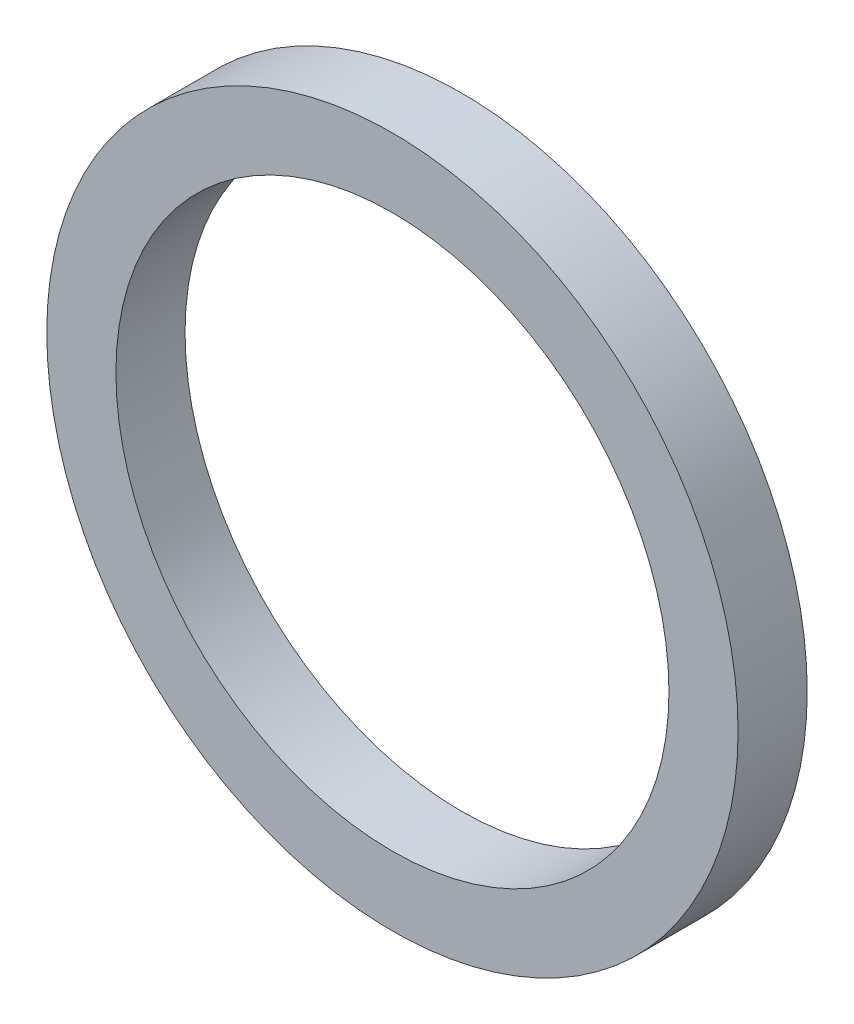
ISO-10303-21;
HEADER;
FILE_DESCRIPTION(('STEP AP214'),'2;1');
FILE_NAME('part.step','',(''),(''),'','','');
FILE_SCHEMA(('AUTOMOTIVE_DESIGN { 1 0 10303 214 1 1 1 1 }'));
ENDSEC;
DATA;
#1=APPLICATION_CONTEXT('core data for automotive mechanical design processes');
#2=APPLICATION_PROTOCOL_DEFINITION('international standard','automotive_design',2000,#1);
#3=PRODUCT_CONTEXT('',#1,'mechanical');
#4=PRODUCT('Part','Part','',(#3));
#5=PRODUCT_RELATED_PRODUCT_CATEGORY('part','',(#4));
#6=PRODUCT_DEFINITION_FORMATION('','',#4);
#7=PRODUCT_DEFINITION_CONTEXT('part definition',#1,'design');
#8=PRODUCT_DEFINITION('design','',#6,#7);
#9=PRODUCT_DEFINITION_SHAPE('','',#8);
#10=(LENGTH_UNIT() NAMED_UNIT(*) SI_UNIT(.MILLI.,.METRE.));
#11=(NAMED_UNIT(*) PLANE_ANGLE_UNIT() SI_UNIT($,.RADIAN.));
#12=(NAMED_UNIT(*) SI_UNIT($,.STERADIAN.) SOLID_ANGLE_UNIT());
#13=UNCERTAINTY_MEASURE_WITH_UNIT(LENGTH_MEASURE(1.E-05),#10,'distance_accuracy_value','');
#14=(GEOMETRIC_REPRESENTATION_CONTEXT(3) GLOBAL_UNCERTAINTY_ASSIGNED_CONTEXT((#13)) GLOBAL_UNIT_ASSIGNED_CONTEXT((#10,
#11,#12)) REPRESENTATION_CONTEXT('',''));
#15=CARTESIAN_POINT('',(0.,0.,0.));
#16=DIRECTION('',(0.,0.,1.));
#17=DIRECTION('',(1.,0.,0.));
#18=AXIS2_PLACEMENT_3D('',#15,#16,#17);
#19=CARTESIAN_POINT('',(0.,0.,1.));
#20=DIRECTION('',(0.,0.,1.));
#21=DIRECTION('',(1.,0.,0.));
#22=AXIS2_PLACEMENT_3D('',#19,#20,#21);
#23=PLANE('',#22);
#24=CARTESIAN_POINT('',(0.,0.,1.));
#25=DIRECTION('',(0.,0.,1.));
#26=DIRECTION('',(1.,0.,0.));
#27=AXIS2_PLACEMENT_3D('',#24,#25,#26);
#28=CIRCLE('',#27,5.);
#29=CARTESIAN_POINT('',(5.,0.,1.));
#30=VERTEX_POINT('',#29);
#31=EDGE_CURVE('E10',#30,#30,#28,.T.);
#32=ORIENTED_EDGE('',*,*,#31,.T.);
#33=EDGE_LOOP('',(#32));
#34=FACE_BOUND('',#33,.T.);
#35=CARTESIAN_POINT('',(0.,0.,1.));
#36=DIRECTION('',(0.,0.,1.));
#37=DIRECTION('',(1.,0.,0.));
#38=AXIS2_PLACEMENT_3D('',#35,#36,#37);
#39=CIRCLE('',#38,4.);
#40=CARTESIAN_POINT('',(4.,0.,1.));
#41=VERTEX_POINT('',#40);
#42=EDGE_CURVE('E43',#41,#41,#39,.T.);
#43=ORIENTED_EDGE('',*,*,#42,.F.);
#44=EDGE_LOOP('',(#43));
#45=FACE_BOUND('',#44,.T.);
#46=ADVANCED_FACE('F32',(#34,#45),#23,.T.);
#47=CARTESIAN_POINT('',(0.,0.,0.));
#48=DIRECTION('',(0.,0.,1.));
#49=DIRECTION('',(1.,0.,0.));
#50=AXIS2_PLACEMENT_3D('',#47,#48,#49);
#51=PLANE('',#50);
#52=CARTESIAN_POINT('',(0.,0.,0.));
#53=DIRECTION('',(0.,0.,1.));
#54=DIRECTION('',(1.,0.,0.));
#55=AXIS2_PLACEMENT_3D('',#52,#53,#54);
#56=CIRCLE('',#55,5.);
#57=CARTESIAN_POINT('',(5.,0.,0.));
#58=VERTEX_POINT('',#57);
#59=EDGE_CURVE('E36',#58,#58,#56,.T.);
#60=ORIENTED_EDGE('',*,*,#59,.F.);
#61=EDGE_LOOP('',(#60));
#62=FACE_BOUND('',#61,.T.);
#63=CARTESIAN_POINT('',(0.,0.,0.));
#64=DIRECTION('',(0.,0.,1.));
#65=DIRECTION('',(1.,0.,0.));
#66=AXIS2_PLACEMENT_3D('',#63,#64,#65);
#67=CIRCLE('',#66,4.);
#68=CARTESIAN_POINT('',(4.,0.,0.));
#69=VERTEX_POINT('',#68);
#70=EDGE_CURVE('E45',#69,#69,#67,.T.);
#71=ORIENTED_EDGE('',*,*,#70,.T.);
#72=EDGE_LOOP('',(#71));
#73=FACE_BOUND('',#72,.T.);
#74=ADVANCED_FACE('F55',(#62,#73),#51,.F.);
#75=CARTESIAN_POINT('',(0.,0.,1.));
#76=DIRECTION('',(0.,0.,-1.));
#77=DIRECTION('',(-1.,0.,0.));
#78=AXIS2_PLACEMENT_3D('',#75,#76,#77);
#79=CYLINDRICAL_SURFACE('',#78,5.);
#80=ORIENTED_EDGE('',*,*,#31,.F.);
#81=EDGE_LOOP('',(#80));
#82=FACE_BOUND('',#81,.T.);
#83=ORIENTED_EDGE('',*,*,#59,.T.);
#84=EDGE_LOOP('',(#83));
#85=FACE_BOUND('',#84,.T.);
#86=ADVANCED_FACE('F34',(#82,#85),#79,.T.);
#87=CARTESIAN_POINT('',(0.,0.,1.));
#88=DIRECTION('',(0.,0.,-1.));
#89=DIRECTION('',(-1.,0.,0.));
#90=AXIS2_PLACEMENT_3D('',#87,#88,#89);
#91=CYLINDRICAL_SURFACE('',#90,4.);
#92=ORIENTED_EDGE('',*,*,#42,.T.);
#93=EDGE_LOOP('',(#92));
#94=FACE_BOUND('',#93,.T.);
#95=ORIENTED_EDGE('',*,*,#70,.F.);
#96=EDGE_LOOP('',(#95));
#97=FACE_BOUND('',#96,.T.);
#98=ADVANCED_FACE('F51',(#94,#97),#91,.F.);
#99=CLOSED_SHELL('',(#46,#74,#86,#98));
#100=MANIFOLD_SOLID_BREP('B2',#99);
#101=ADVANCED_BREP_SHAPE_REPRESENTATION('',(#18,#100),#14);
#102=SHAPE_DEFINITION_REPRESENTATION(#9,#101);
ENDSEC;
END-ISO-10303-21;
